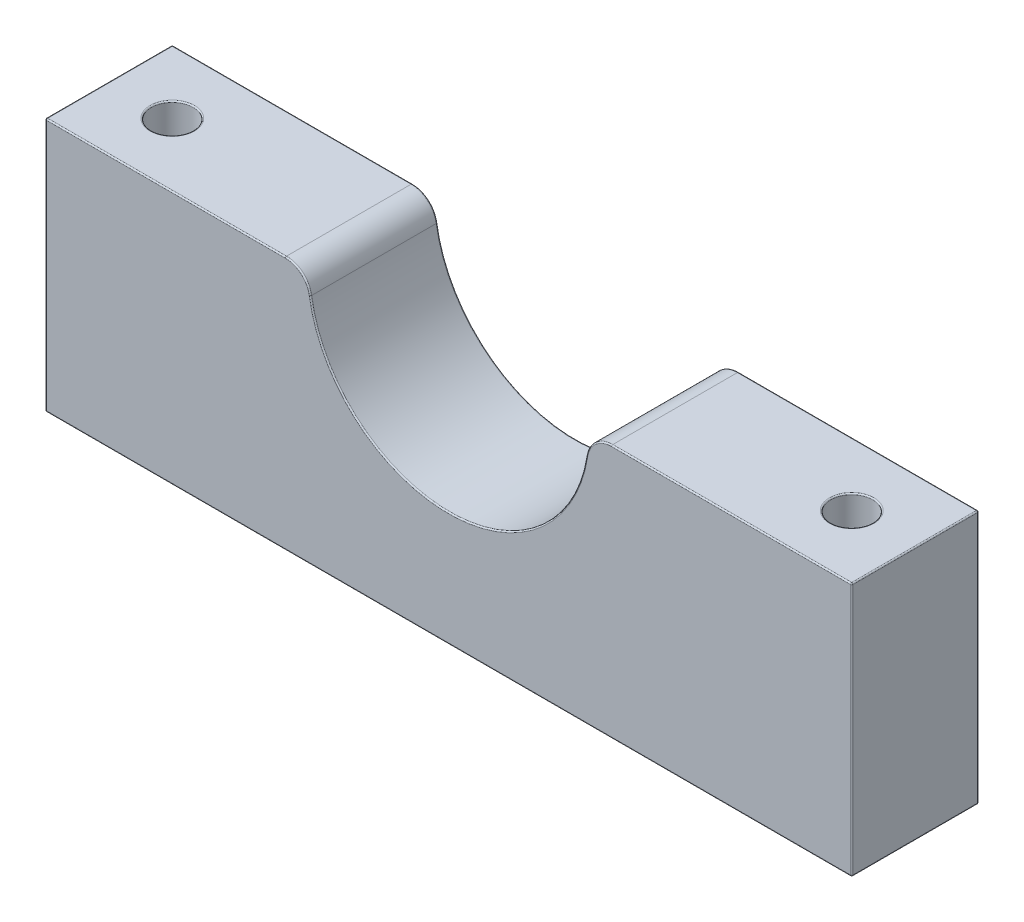
ISO-10303-21;
HEADER;
FILE_DESCRIPTION(('STEP AP214'),'2;1');
FILE_NAME('part.step','',(''),(''),'','','');
FILE_SCHEMA(('AUTOMOTIVE_DESIGN { 1 0 10303 214 1 1 1 1 }'));
ENDSEC;
DATA;
#1=APPLICATION_CONTEXT('core data for automotive mechanical design processes');
#2=APPLICATION_PROTOCOL_DEFINITION('international standard','automotive_design',2000,#1);
#3=PRODUCT_CONTEXT('',#1,'mechanical');
#4=PRODUCT('Part','Part','',(#3));
#5=PRODUCT_RELATED_PRODUCT_CATEGORY('part','',(#4));
#6=PRODUCT_DEFINITION_FORMATION('','',#4);
#7=PRODUCT_DEFINITION_CONTEXT('part definition',#1,'design');
#8=PRODUCT_DEFINITION('design','',#6,#7);
#9=PRODUCT_DEFINITION_SHAPE('','',#8);
#10=(LENGTH_UNIT() NAMED_UNIT(*) SI_UNIT(.MILLI.,.METRE.));
#11=(NAMED_UNIT(*) PLANE_ANGLE_UNIT() SI_UNIT($,.RADIAN.));
#12=(NAMED_UNIT(*) SI_UNIT($,.STERADIAN.) SOLID_ANGLE_UNIT());
#13=UNCERTAINTY_MEASURE_WITH_UNIT(LENGTH_MEASURE(1.E-05),#10,'distance_accuracy_value','');
#14=(GEOMETRIC_REPRESENTATION_CONTEXT(3) GLOBAL_UNCERTAINTY_ASSIGNED_CONTEXT((#13)) GLOBAL_UNIT_ASSIGNED_CONTEXT((#10,
#11,#12)) REPRESENTATION_CONTEXT('',''));
#15=CARTESIAN_POINT('',(0.,0.,0.));
#16=DIRECTION('',(0.,0.,1.));
#17=DIRECTION('',(1.,0.,0.));
#18=AXIS2_PLACEMENT_3D('',#15,#16,#17);
#19=CARTESIAN_POINT('',(0.,0.,10.));
#20=DIRECTION('',(0.,0.,-1.));
#21=DIRECTION('',(-1.,0.,0.));
#22=AXIS2_PLACEMENT_3D('',#19,#20,#21);
#23=CYLINDRICAL_SURFACE('',#22,11.);
#24=DIRECTION('',(0.,0.,-1.));
#25=VECTOR('',#24,1.);
#26=CARTESIAN_POINT('',(10.8690429511782,-1.69230769230769,10.));
#27=LINE('',#26,#25);
#28=CARTESIAN_POINT('',(10.8690429511782,-1.69230769230769,9.9));
#29=VERTEX_POINT('',#28);
#30=CARTESIAN_POINT('',(10.8690429511782,-1.69230769230769,0.0999999999999994));
#31=VERTEX_POINT('',#30);
#32=EDGE_CURVE('E196',#29,#31,#27,.T.);
#33=ORIENTED_EDGE('',*,*,#32,.T.);
#34=CARTESIAN_POINT('',(0.,0.,0.0999999999999994));
#35=DIRECTION('',(0.,0.,1.));
#36=DIRECTION('',(1.,0.,0.));
#37=AXIS2_PLACEMENT_3D('',#34,#35,#36);
#38=CIRCLE('',#37,11.);
#39=CARTESIAN_POINT('',(-10.8690429511782,-1.69230769230769,0.0999999999999994));
#40=VERTEX_POINT('',#39);
#41=EDGE_CURVE('E383',#31,#40,#38,.F.);
#42=ORIENTED_EDGE('',*,*,#41,.T.);
#43=DIRECTION('',(0.,0.,-1.));
#44=VECTOR('',#43,1.);
#45=CARTESIAN_POINT('',(-10.8690429511782,-1.69230769230769,10.));
#46=LINE('',#45,#44);
#47=CARTESIAN_POINT('',(-10.8690429511782,-1.69230769230769,9.9));
#48=VERTEX_POINT('',#47);
#49=EDGE_CURVE('E288',#40,#48,#46,.F.);
#50=ORIENTED_EDGE('',*,*,#49,.T.);
#51=CARTESIAN_POINT('',(0.,0.,9.9));
#52=DIRECTION('',(0.,0.,1.));
#53=DIRECTION('',(1.,0.,0.));
#54=AXIS2_PLACEMENT_3D('',#51,#52,#53);
#55=CIRCLE('',#54,11.);
#56=EDGE_CURVE('E207',#48,#29,#55,.T.);
#57=ORIENTED_EDGE('',*,*,#56,.T.);
#58=EDGE_LOOP('',(#33,#42,#50,#57));
#59=FACE_BOUND('',#58,.T.);
#60=ADVANCED_FACE('F37',(#59),#23,.F.);
#61=CARTESIAN_POINT('',(-31.75,0.,10.));
#62=DIRECTION('',(0.,-1.,0.));
#63=DIRECTION('',(1.,0.,0.));
#64=AXIS2_PLACEMENT_3D('',#61,#62,#63);
#65=PLANE('',#64);
#66=CARTESIAN_POINT('',(-26.75,0.,5.));
#67=DIRECTION('',(0.,-1.,0.));
#68=DIRECTION('',(1.,0.,0.));
#69=AXIS2_PLACEMENT_3D('',#66,#67,#68);
#70=CIRCLE('',#69,1.74999999999999);
#71=CARTESIAN_POINT('',(-25.,0.,5.));
#72=VERTEX_POINT('',#71);
#73=EDGE_CURVE('E337',#72,#72,#70,.T.);
#74=ORIENTED_EDGE('',*,*,#73,.T.);
#75=EDGE_LOOP('',(#74));
#76=FACE_BOUND('',#75,.T.);
#77=DIRECTION('',(0.,0.,-1.));
#78=VECTOR('',#77,1.);
#79=CARTESIAN_POINT('',(-12.8452325786651,0.,10.));
#80=LINE('',#79,#78);
#81=CARTESIAN_POINT('',(-12.8452325786651,0.,9.9));
#82=VERTEX_POINT('',#81);
#83=CARTESIAN_POINT('',(-12.8452325786651,0.,0.0999999999999994));
#84=VERTEX_POINT('',#83);
#85=EDGE_CURVE('E195',#82,#84,#80,.T.);
#86=ORIENTED_EDGE('',*,*,#85,.T.);
#87=DIRECTION('',(-1.,0.,0.));
#88=VECTOR('',#87,1.);
#89=CARTESIAN_POINT('',(-31.75,0.,0.0999999999999994));
#90=LINE('',#89,#88);
#91=CARTESIAN_POINT('',(-31.65,0.,0.0999999999999994));
#92=VERTEX_POINT('',#91);
#93=EDGE_CURVE('E335',#84,#92,#90,.T.);
#94=ORIENTED_EDGE('',*,*,#93,.T.);
#95=DIRECTION('',(0.,0.,-1.));
#96=VECTOR('',#95,1.);
#97=CARTESIAN_POINT('',(-31.65,0.,10.));
#98=LINE('',#97,#96);
#99=CARTESIAN_POINT('',(-31.65,0.,9.9));
#100=VERTEX_POINT('',#99);
#101=EDGE_CURVE('E333',#92,#100,#98,.F.);
#102=ORIENTED_EDGE('',*,*,#101,.T.);
#103=DIRECTION('',(-1.,0.,0.));
#104=VECTOR('',#103,1.);
#105=CARTESIAN_POINT('',(-12.8452325786651,0.,9.9));
#106=LINE('',#105,#104);
#107=EDGE_CURVE('E331',#100,#82,#106,.F.);
#108=ORIENTED_EDGE('',*,*,#107,.T.);
#109=EDGE_LOOP('',(#86,#94,#102,#108));
#110=FACE_BOUND('',#109,.T.);
#111=ADVANCED_FACE('F514',(#76,#110),#65,.F.);
#112=CARTESIAN_POINT('',(-31.75,0.,10.));
#113=DIRECTION('',(1.,0.,0.));
#114=DIRECTION('',(0.,1.,0.));
#115=AXIS2_PLACEMENT_3D('',#112,#113,#114);
#116=PLANE('',#115);
#117=DIRECTION('',(0.,0.,-1.));
#118=VECTOR('',#117,1.);
#119=CARTESIAN_POINT('',(-31.75,-0.0999999999999999,10.));
#120=LINE('',#119,#118);
#121=CARTESIAN_POINT('',(-31.75,-0.0999999999999999,9.9));
#122=VERTEX_POINT('',#121);
#123=CARTESIAN_POINT('',(-31.75,-0.0999999999999999,0.0999999999999994));
#124=VERTEX_POINT('',#123);
#125=EDGE_CURVE('E326',#122,#124,#120,.T.);
#126=ORIENTED_EDGE('',*,*,#125,.T.);
#127=DIRECTION('',(0.,-1.,0.));
#128=VECTOR('',#127,1.);
#129=CARTESIAN_POINT('',(-31.75,0.,0.0999999999999994));
#130=LINE('',#129,#128);
#131=CARTESIAN_POINT('',(-31.75,-19.9,0.0999999999999994));
#132=VERTEX_POINT('',#131);
#133=EDGE_CURVE('E329',#124,#132,#130,.T.);
#134=ORIENTED_EDGE('',*,*,#133,.T.);
#135=DIRECTION('',(0.,0.,-1.));
#136=VECTOR('',#135,1.);
#137=CARTESIAN_POINT('',(-31.75,-19.9,10.));
#138=LINE('',#137,#136);
#139=CARTESIAN_POINT('',(-31.75,-19.9,9.9));
#140=VERTEX_POINT('',#139);
#141=EDGE_CURVE('E324',#132,#140,#138,.F.);
#142=ORIENTED_EDGE('',*,*,#141,.T.);
#143=DIRECTION('',(0.,-1.,0.));
#144=VECTOR('',#143,1.);
#145=CARTESIAN_POINT('',(-31.75,0.,9.9));
#146=LINE('',#145,#144);
#147=EDGE_CURVE('E322',#140,#122,#146,.F.);
#148=ORIENTED_EDGE('',*,*,#147,.T.);
#149=EDGE_LOOP('',(#126,#134,#142,#148));
#150=FACE_BOUND('',#149,.T.);
#151=ADVANCED_FACE('F519',(#150),#116,.F.);
#152=CARTESIAN_POINT('',(-31.75,-20.,10.));
#153=DIRECTION('',(0.,1.,0.));
#154=DIRECTION('',(0.,0.,1.));
#155=AXIS2_PLACEMENT_3D('',#152,#153,#154);
#156=PLANE('',#155);
#157=CARTESIAN_POINT('',(26.75,-20.,5.));
#158=DIRECTION('',(0.,1.,0.));
#159=DIRECTION('',(0.,0.,1.));
#160=AXIS2_PLACEMENT_3D('',#157,#158,#159);
#161=CIRCLE('',#160,1.74999999999999);
#162=CARTESIAN_POINT('',(26.75,-20.,6.74999999999999));
#163=VERTEX_POINT('',#162);
#164=EDGE_CURVE('E358',#163,#163,#161,.T.);
#165=ORIENTED_EDGE('',*,*,#164,.T.);
#166=EDGE_LOOP('',(#165));
#167=FACE_BOUND('',#166,.T.);
#168=CARTESIAN_POINT('',(-26.75,-20.,5.));
#169=DIRECTION('',(0.,1.,0.));
#170=DIRECTION('',(0.,0.,1.));
#171=AXIS2_PLACEMENT_3D('',#168,#169,#170);
#172=CIRCLE('',#171,1.74999999999999);
#173=CARTESIAN_POINT('',(-26.75,-20.,6.74999999999999));
#174=VERTEX_POINT('',#173);
#175=EDGE_CURVE('E355',#174,#174,#172,.T.);
#176=ORIENTED_EDGE('',*,*,#175,.T.);
#177=EDGE_LOOP('',(#176));
#178=FACE_BOUND('',#177,.T.);
#179=DIRECTION('',(0.,0.,-1.));
#180=VECTOR('',#179,1.);
#181=CARTESIAN_POINT('',(-31.65,-20.,10.));
#182=LINE('',#181,#180);
#183=CARTESIAN_POINT('',(-31.65,-20.,9.9));
#184=VERTEX_POINT('',#183);
#185=CARTESIAN_POINT('',(-31.65,-20.,0.0999999999999994));
#186=VERTEX_POINT('',#185);
#187=EDGE_CURVE('E350',#184,#186,#182,.T.);
#188=ORIENTED_EDGE('',*,*,#187,.T.);
#189=DIRECTION('',(1.,0.,0.));
#190=VECTOR('',#189,1.);
#191=CARTESIAN_POINT('',(-31.75,-20.,0.0999999999999994));
#192=LINE('',#191,#190);
#193=CARTESIAN_POINT('',(31.65,-20.,0.0999999999999994));
#194=VERTEX_POINT('',#193);
#195=EDGE_CURVE('E353',#186,#194,#192,.T.);
#196=ORIENTED_EDGE('',*,*,#195,.T.);
#197=DIRECTION('',(0.,0.,-1.));
#198=VECTOR('',#197,1.);
#199=CARTESIAN_POINT('',(31.65,-20.,10.));
#200=LINE('',#199,#198);
#201=CARTESIAN_POINT('',(31.65,-20.,9.9));
#202=VERTEX_POINT('',#201);
#203=EDGE_CURVE('E348',#194,#202,#200,.F.);
#204=ORIENTED_EDGE('',*,*,#203,.T.);
#205=DIRECTION('',(1.,0.,0.));
#206=VECTOR('',#205,1.);
#207=CARTESIAN_POINT('',(-31.75,-20.,9.9));
#208=LINE('',#207,#206);
#209=EDGE_CURVE('E346',#202,#184,#208,.F.);
#210=ORIENTED_EDGE('',*,*,#209,.T.);
#211=EDGE_LOOP('',(#188,#196,#204,#210));
#212=FACE_BOUND('',#211,.T.);
#213=ADVANCED_FACE('F452',(#167,#178,#212),#156,.F.);
#214=CARTESIAN_POINT('',(31.75,0.,10.));
#215=DIRECTION('',(-1.,0.,0.));
#216=DIRECTION('',(0.,-1.,0.));
#217=AXIS2_PLACEMENT_3D('',#214,#215,#216);
#218=PLANE('',#217);
#219=DIRECTION('',(0.,0.,-1.));
#220=VECTOR('',#219,1.);
#221=CARTESIAN_POINT('',(31.75,-19.9,10.));
#222=LINE('',#221,#220);
#223=CARTESIAN_POINT('',(31.75,-19.9,9.9));
#224=VERTEX_POINT('',#223);
#225=CARTESIAN_POINT('',(31.75,-19.9,0.0999999999999994));
#226=VERTEX_POINT('',#225);
#227=EDGE_CURVE('E309',#224,#226,#222,.T.);
#228=ORIENTED_EDGE('',*,*,#227,.T.);
#229=DIRECTION('',(0.,1.,0.));
#230=VECTOR('',#229,1.);
#231=CARTESIAN_POINT('',(31.75,0.,0.0999999999999994));
#232=LINE('',#231,#230);
#233=CARTESIAN_POINT('',(31.75,-0.0999999999999922,0.0999999999999994));
#234=VERTEX_POINT('',#233);
#235=EDGE_CURVE('E314',#226,#234,#232,.T.);
#236=ORIENTED_EDGE('',*,*,#235,.T.);
#237=DIRECTION('',(0.,0.,-1.));
#238=VECTOR('',#237,1.);
#239=CARTESIAN_POINT('',(31.75,-0.0999999999999922,10.));
#240=LINE('',#239,#238);
#241=CARTESIAN_POINT('',(31.75,-0.0999999999999922,9.9));
#242=VERTEX_POINT('',#241);
#243=EDGE_CURVE('E311',#234,#242,#240,.F.);
#244=ORIENTED_EDGE('',*,*,#243,.T.);
#245=DIRECTION('',(0.,1.,0.));
#246=VECTOR('',#245,1.);
#247=CARTESIAN_POINT('',(31.75,-20.,9.9));
#248=LINE('',#247,#246);
#249=EDGE_CURVE('E307',#242,#224,#248,.F.);
#250=ORIENTED_EDGE('',*,*,#249,.T.);
#251=EDGE_LOOP('',(#228,#236,#244,#250));
#252=FACE_BOUND('',#251,.T.);
#253=ADVANCED_FACE('F423',(#252),#218,.F.);
#254=CARTESIAN_POINT('',(11.,0.,10.));
#255=DIRECTION('',(0.,-1.,0.));
#256=DIRECTION('',(1.,0.,0.));
#257=AXIS2_PLACEMENT_3D('',#254,#255,#256);
#258=PLANE('',#257);
#259=CARTESIAN_POINT('',(26.75,0.,5.));
#260=DIRECTION('',(0.,-1.,0.));
#261=DIRECTION('',(1.,0.,0.));
#262=AXIS2_PLACEMENT_3D('',#259,#260,#261);
#263=CIRCLE('',#262,1.74999999999999);
#264=CARTESIAN_POINT('',(28.5,0.,5.));
#265=VERTEX_POINT('',#264);
#266=EDGE_CURVE('E185',#265,#265,#263,.T.);
#267=ORIENTED_EDGE('',*,*,#266,.T.);
#268=EDGE_LOOP('',(#267));
#269=FACE_BOUND('',#268,.T.);
#270=DIRECTION('',(0.,0.,-1.));
#271=VECTOR('',#270,1.);
#272=CARTESIAN_POINT('',(31.65,0.,10.));
#273=LINE('',#272,#271);
#274=CARTESIAN_POINT('',(31.65,0.,9.9));
#275=VERTEX_POINT('',#274);
#276=CARTESIAN_POINT('',(31.65,0.,0.0999999999999994));
#277=VERTEX_POINT('',#276);
#278=EDGE_CURVE('E181',#275,#277,#273,.T.);
#279=ORIENTED_EDGE('',*,*,#278,.T.);
#280=DIRECTION('',(-1.,0.,0.));
#281=VECTOR('',#280,1.);
#282=CARTESIAN_POINT('',(11.,0.,0.0999999999999994));
#283=LINE('',#282,#281);
#284=CARTESIAN_POINT('',(12.8452325786651,0.,0.0999999999999994));
#285=VERTEX_POINT('',#284);
#286=EDGE_CURVE('E175',#277,#285,#283,.T.);
#287=ORIENTED_EDGE('',*,*,#286,.T.);
#288=DIRECTION('',(0.,0.,-1.));
#289=VECTOR('',#288,1.);
#290=CARTESIAN_POINT('',(12.8452325786651,0.,10.));
#291=LINE('',#290,#289);
#292=CARTESIAN_POINT('',(12.8452325786651,0.,9.9));
#293=VERTEX_POINT('',#292);
#294=EDGE_CURVE('E178',#285,#293,#291,.F.);
#295=ORIENTED_EDGE('',*,*,#294,.T.);
#296=DIRECTION('',(-1.,0.,0.));
#297=VECTOR('',#296,1.);
#298=CARTESIAN_POINT('',(31.75,0.,9.9));
#299=LINE('',#298,#297);
#300=EDGE_CURVE('E302',#293,#275,#299,.F.);
#301=ORIENTED_EDGE('',*,*,#300,.T.);
#302=EDGE_LOOP('',(#279,#287,#295,#301));
#303=FACE_BOUND('',#302,.T.);
#304=ADVANCED_FACE('F177',(#269,#303),#258,.F.);
#305=CARTESIAN_POINT('',(0.,0.,10.));
#306=DIRECTION('',(0.,0.,1.));
#307=DIRECTION('',(1.,0.,0.));
#308=AXIS2_PLACEMENT_3D('',#305,#306,#307);
#309=PLANE('',#308);
#310=DIRECTION('',(1.,0.,0.));
#311=VECTOR('',#310,1.);
#312=CARTESIAN_POINT('',(31.75,-19.9,10.));
#313=LINE('',#312,#311);
#314=CARTESIAN_POINT('',(-31.65,-19.9,10.));
#315=VERTEX_POINT('',#314);
#316=CARTESIAN_POINT('',(31.65,-19.9,10.));
#317=VERTEX_POINT('',#316);
#318=EDGE_CURVE('E46',#315,#317,#313,.T.);
#319=ORIENTED_EDGE('',*,*,#318,.T.);
#320=DIRECTION('',(0.,1.,0.));
#321=VECTOR('',#320,1.);
#322=CARTESIAN_POINT('',(31.65,0.,10.));
#323=LINE('',#322,#321);
#324=CARTESIAN_POINT('',(31.65,-0.0999999999999922,10.));
#325=VERTEX_POINT('',#324);
#326=EDGE_CURVE('E11',#317,#325,#323,.T.);
#327=ORIENTED_EDGE('',*,*,#326,.T.);
#328=DIRECTION('',(-1.,0.,0.));
#329=VECTOR('',#328,1.);
#330=CARTESIAN_POINT('',(12.8452325786651,-0.0999999999999945,10.));
#331=LINE('',#330,#329);
#332=CARTESIAN_POINT('',(12.8452325786651,-0.0999999999999945,10.));
#333=VERTEX_POINT('',#332);
#334=EDGE_CURVE('E385',#325,#333,#331,.T.);
#335=ORIENTED_EDGE('',*,*,#334,.T.);
#336=CARTESIAN_POINT('',(12.8452325786651,-1.99999999999999,10.));
#337=DIRECTION('',(0.,0.,1.));
#338=DIRECTION('',(1.,0.,0.));
#339=AXIS2_PLACEMENT_3D('',#336,#337,#338);
#340=CIRCLE('',#339,1.9);
#341=CARTESIAN_POINT('',(10.9678524325525,-1.7076923076923,10.));
#342=VERTEX_POINT('',#341);
#343=EDGE_CURVE('E387',#333,#342,#340,.T.);
#344=ORIENTED_EDGE('',*,*,#343,.T.);
#345=CARTESIAN_POINT('',(0.,0.,10.));
#346=DIRECTION('',(0.,0.,1.));
#347=DIRECTION('',(1.,0.,0.));
#348=AXIS2_PLACEMENT_3D('',#345,#346,#347);
#349=CIRCLE('',#348,11.1);
#350=CARTESIAN_POINT('',(-10.9678524325525,-1.70769230769231,10.));
#351=VERTEX_POINT('',#350);
#352=EDGE_CURVE('E389',#342,#351,#349,.F.);
#353=ORIENTED_EDGE('',*,*,#352,.T.);
#354=CARTESIAN_POINT('',(-12.8452325786651,-2.,10.));
#355=DIRECTION('',(0.,0.,1.));
#356=DIRECTION('',(1.,0.,0.));
#357=AXIS2_PLACEMENT_3D('',#354,#355,#356);
#358=CIRCLE('',#357,1.9);
#359=CARTESIAN_POINT('',(-12.8452325786651,-0.0999999999999979,10.));
#360=VERTEX_POINT('',#359);
#361=EDGE_CURVE('E391',#351,#360,#358,.T.);
#362=ORIENTED_EDGE('',*,*,#361,.T.);
#363=DIRECTION('',(-1.,0.,0.));
#364=VECTOR('',#363,1.);
#365=CARTESIAN_POINT('',(-31.75,-0.1,10.));
#366=LINE('',#365,#364);
#367=CARTESIAN_POINT('',(-31.65,-0.1,10.));
#368=VERTEX_POINT('',#367);
#369=EDGE_CURVE('E393',#360,#368,#366,.T.);
#370=ORIENTED_EDGE('',*,*,#369,.T.);
#371=DIRECTION('',(0.,-1.,0.));
#372=VECTOR('',#371,1.);
#373=CARTESIAN_POINT('',(-31.65,-20.,10.));
#374=LINE('',#373,#372);
#375=EDGE_CURVE('E57',#368,#315,#374,.T.);
#376=ORIENTED_EDGE('',*,*,#375,.T.);
#377=EDGE_LOOP('',(#319,#327,#335,#344,#353,#362,#370,#376));
#378=FACE_BOUND('',#377,.T.);
#379=ADVANCED_FACE('F501',(#378),#309,.T.);
#380=CARTESIAN_POINT('',(0.,0.,0.));
#381=DIRECTION('',(0.,0.,1.));
#382=DIRECTION('',(1.,0.,0.));
#383=AXIS2_PLACEMENT_3D('',#380,#381,#382);
#384=PLANE('',#383);
#385=DIRECTION('',(-1.,0.,0.));
#386=VECTOR('',#385,1.);
#387=CARTESIAN_POINT('',(0.,-0.0999999999999961,0.));
#388=LINE('',#387,#386);
#389=CARTESIAN_POINT('',(-31.65,-0.1,0.));
#390=VERTEX_POINT('',#389);
#391=CARTESIAN_POINT('',(-12.8452325786651,-0.0999999999999977,0.));
#392=VERTEX_POINT('',#391);
#393=EDGE_CURVE('E372',#390,#392,#388,.F.);
#394=ORIENTED_EDGE('',*,*,#393,.T.);
#395=CARTESIAN_POINT('',(-12.8452325786651,-2.,0.));
#396=DIRECTION('',(0.,0.,1.));
#397=DIRECTION('',(1.,0.,0.));
#398=AXIS2_PLACEMENT_3D('',#395,#396,#397);
#399=CIRCLE('',#398,1.9);
#400=CARTESIAN_POINT('',(-10.9678524325525,-1.70769230769231,0.));
#401=VERTEX_POINT('',#400);
#402=EDGE_CURVE('E374',#392,#401,#399,.F.);
#403=ORIENTED_EDGE('',*,*,#402,.T.);
#404=CARTESIAN_POINT('',(0.,0.,0.));
#405=DIRECTION('',(0.,0.,1.));
#406=DIRECTION('',(1.,0.,0.));
#407=AXIS2_PLACEMENT_3D('',#404,#405,#406);
#408=CIRCLE('',#407,11.1);
#409=CARTESIAN_POINT('',(10.9678524325525,-1.7076923076923,0.));
#410=VERTEX_POINT('',#409);
#411=EDGE_CURVE('E361',#401,#410,#408,.T.);
#412=ORIENTED_EDGE('',*,*,#411,.T.);
#413=CARTESIAN_POINT('',(12.8452325786651,-1.99999999999999,0.));
#414=DIRECTION('',(0.,0.,1.));
#415=DIRECTION('',(1.,0.,0.));
#416=AXIS2_PLACEMENT_3D('',#413,#414,#415);
#417=CIRCLE('',#416,1.9);
#418=CARTESIAN_POINT('',(12.8452325786651,-0.0999999999999945,0.));
#419=VERTEX_POINT('',#418);
#420=EDGE_CURVE('E363',#410,#419,#417,.F.);
#421=ORIENTED_EDGE('',*,*,#420,.T.);
#422=DIRECTION('',(-1.,0.,0.));
#423=VECTOR('',#422,1.);
#424=CARTESIAN_POINT('',(0.,-0.0999999999999961,0.));
#425=LINE('',#424,#423);
#426=CARTESIAN_POINT('',(31.65,-0.0999999999999922,0.));
#427=VERTEX_POINT('',#426);
#428=EDGE_CURVE('E210',#419,#427,#425,.F.);
#429=ORIENTED_EDGE('',*,*,#428,.T.);
#430=DIRECTION('',(0.,1.,0.));
#431=VECTOR('',#430,1.);
#432=CARTESIAN_POINT('',(31.65,0.,0.));
#433=LINE('',#432,#431);
#434=CARTESIAN_POINT('',(31.65,-19.9,0.));
#435=VERTEX_POINT('',#434);
#436=EDGE_CURVE('E366',#427,#435,#433,.F.);
#437=ORIENTED_EDGE('',*,*,#436,.T.);
#438=DIRECTION('',(1.,0.,0.));
#439=VECTOR('',#438,1.);
#440=CARTESIAN_POINT('',(0.,-19.9,0.));
#441=LINE('',#440,#439);
#442=CARTESIAN_POINT('',(-31.65,-19.9,0.));
#443=VERTEX_POINT('',#442);
#444=EDGE_CURVE('E368',#435,#443,#441,.F.);
#445=ORIENTED_EDGE('',*,*,#444,.T.);
#446=DIRECTION('',(0.,-1.,0.));
#447=VECTOR('',#446,1.);
#448=CARTESIAN_POINT('',(-31.65,0.,0.));
#449=LINE('',#448,#447);
#450=EDGE_CURVE('E370',#443,#390,#449,.F.);
#451=ORIENTED_EDGE('',*,*,#450,.T.);
#452=EDGE_LOOP('',(#394,#403,#412,#421,#429,#437,#445,#451));
#453=FACE_BOUND('',#452,.T.);
#454=ADVANCED_FACE('F437',(#453),#384,.F.);
#455=CARTESIAN_POINT('',(26.75,-20.,5.));
#456=DIRECTION('',(0.,-1.,0.));
#457=DIRECTION('',(0.,0.,-1.));
#458=AXIS2_PLACEMENT_3D('',#455,#456,#457);
#459=CYLINDRICAL_SURFACE('',#458,1.64999999999999);
#460=CARTESIAN_POINT('',(26.75,-0.0999999999999925,5.));
#461=DIRECTION('',(0.,-1.,0.));
#462=DIRECTION('',(1.,0.,0.));
#463=AXIS2_PLACEMENT_3D('',#460,#461,#462);
#464=CIRCLE('',#463,1.64999999999999);
#465=CARTESIAN_POINT('',(28.4,-0.0999999999999922,5.));
#466=VERTEX_POINT('',#465);
#467=EDGE_CURVE('E319',#466,#466,#464,.F.);
#468=ORIENTED_EDGE('',*,*,#467,.T.);
#469=EDGE_LOOP('',(#468));
#470=FACE_BOUND('',#469,.T.);
#471=CARTESIAN_POINT('',(26.75,-19.9,5.));
#472=DIRECTION('',(0.,1.,0.));
#473=DIRECTION('',(0.,0.,1.));
#474=AXIS2_PLACEMENT_3D('',#471,#472,#473);
#475=CIRCLE('',#474,1.64999999999999);
#476=CARTESIAN_POINT('',(26.75,-19.9,6.64999999999999));
#477=VERTEX_POINT('',#476);
#478=EDGE_CURVE('E316',#477,#477,#475,.F.);
#479=ORIENTED_EDGE('',*,*,#478,.T.);
#480=EDGE_LOOP('',(#479));
#481=FACE_BOUND('',#480,.T.);
#482=ADVANCED_FACE('F508',(#470,#481),#459,.F.);
#483=CARTESIAN_POINT('',(-26.75,-20.,5.));
#484=DIRECTION('',(0.,-1.,0.));
#485=DIRECTION('',(0.,0.,-1.));
#486=AXIS2_PLACEMENT_3D('',#483,#484,#485);
#487=CYLINDRICAL_SURFACE('',#486,1.64999999999999);
#488=CARTESIAN_POINT('',(-26.75,-0.0999999999999994,5.));
#489=DIRECTION('',(0.,-1.,0.));
#490=DIRECTION('',(1.,0.,0.));
#491=AXIS2_PLACEMENT_3D('',#488,#489,#490);
#492=CIRCLE('',#491,1.64999999999999);
#493=CARTESIAN_POINT('',(-25.1,-0.0999999999999992,5.));
#494=VERTEX_POINT('',#493);
#495=EDGE_CURVE('E343',#494,#494,#492,.F.);
#496=ORIENTED_EDGE('',*,*,#495,.T.);
#497=EDGE_LOOP('',(#496));
#498=FACE_BOUND('',#497,.T.);
#499=CARTESIAN_POINT('',(-26.75,-19.9,5.));
#500=DIRECTION('',(0.,1.,0.));
#501=DIRECTION('',(0.,0.,1.));
#502=AXIS2_PLACEMENT_3D('',#499,#500,#501);
#503=CIRCLE('',#502,1.64999999999999);
#504=CARTESIAN_POINT('',(-26.75,-19.9,6.64999999999999));
#505=VERTEX_POINT('',#504);
#506=EDGE_CURVE('E340',#505,#505,#503,.F.);
#507=ORIENTED_EDGE('',*,*,#506,.T.);
#508=EDGE_LOOP('',(#507));
#509=FACE_BOUND('',#508,.T.);
#510=ADVANCED_FACE('F526',(#498,#509),#487,.F.);
#511=CARTESIAN_POINT('',(12.8452325786651,-1.99999999999999,10.));
#512=DIRECTION('',(0.,0.,-1.));
#513=DIRECTION('',(-1.,0.,0.));
#514=AXIS2_PLACEMENT_3D('',#511,#512,#513);
#515=CYLINDRICAL_SURFACE('',#514,2.);
#516=ORIENTED_EDGE('',*,*,#294,.F.);
#517=CARTESIAN_POINT('',(12.8452325786651,-1.99999999999999,0.0999999999999994));
#518=DIRECTION('',(0.,0.,1.));
#519=DIRECTION('',(1.,0.,0.));
#520=AXIS2_PLACEMENT_3D('',#517,#518,#519);
#521=CIRCLE('',#520,2.);
#522=EDGE_CURVE('E191',#285,#31,#521,.T.);
#523=ORIENTED_EDGE('',*,*,#522,.T.);
#524=ORIENTED_EDGE('',*,*,#32,.F.);
#525=CARTESIAN_POINT('',(12.8452325786651,-1.99999999999999,9.9));
#526=DIRECTION('',(0.,0.,1.));
#527=DIRECTION('',(1.,0.,0.));
#528=AXIS2_PLACEMENT_3D('',#525,#526,#527);
#529=CIRCLE('',#528,2.);
#530=EDGE_CURVE('E194',#29,#293,#529,.F.);
#531=ORIENTED_EDGE('',*,*,#530,.T.);
#532=EDGE_LOOP('',(#516,#523,#524,#531));
#533=FACE_BOUND('',#532,.T.);
#534=ADVANCED_FACE('F189',(#533),#515,.T.);
#535=CARTESIAN_POINT('',(-12.8452325786651,-2.,10.));
#536=DIRECTION('',(0.,0.,-1.));
#537=DIRECTION('',(-1.,0.,0.));
#538=AXIS2_PLACEMENT_3D('',#535,#536,#537);
#539=CYLINDRICAL_SURFACE('',#538,2.);
#540=ORIENTED_EDGE('',*,*,#49,.F.);
#541=CARTESIAN_POINT('',(-12.8452325786651,-2.,0.0999999999999994));
#542=DIRECTION('',(0.,0.,1.));
#543=DIRECTION('',(1.,0.,0.));
#544=AXIS2_PLACEMENT_3D('',#541,#542,#543);
#545=CIRCLE('',#544,2.);
#546=EDGE_CURVE('E379',#40,#84,#545,.T.);
#547=ORIENTED_EDGE('',*,*,#546,.T.);
#548=ORIENTED_EDGE('',*,*,#85,.F.);
#549=CARTESIAN_POINT('',(-12.8452325786651,-2.,9.9));
#550=DIRECTION('',(0.,0.,1.));
#551=DIRECTION('',(1.,0.,0.));
#552=AXIS2_PLACEMENT_3D('',#549,#550,#551);
#553=CIRCLE('',#552,2.);
#554=EDGE_CURVE('E377',#82,#48,#553,.F.);
#555=ORIENTED_EDGE('',*,*,#554,.T.);
#556=EDGE_LOOP('',(#540,#547,#548,#555));
#557=FACE_BOUND('',#556,.T.);
#558=ADVANCED_FACE('F483',(#557),#539,.T.);
#559=CARTESIAN_POINT('',(-31.65,-0.1,10.));
#560=DIRECTION('',(0.,0.,-1.));
#561=DIRECTION('',(-1.,0.,0.));
#562=AXIS2_PLACEMENT_3D('',#559,#560,#561);
#563=CYLINDRICAL_SURFACE('',#562,0.1);
#564=CARTESIAN_POINT('',(-31.65,-0.1,9.9));
#565=DIRECTION('',(0.,0.,1.));
#566=DIRECTION('',(1.,0.,0.));
#567=AXIS2_PLACEMENT_3D('',#564,#565,#566);
#568=CIRCLE('',#567,0.1);
#569=EDGE_CURVE('E41',#100,#122,#568,.T.);
#570=ORIENTED_EDGE('',*,*,#569,.F.);
#571=ORIENTED_EDGE('',*,*,#101,.F.);
#572=CARTESIAN_POINT('',(-31.65,-0.1,0.0999999999999994));
#573=DIRECTION('',(0.,0.,-1.));
#574=DIRECTION('',(-1.,0.,0.));
#575=AXIS2_PLACEMENT_3D('',#572,#573,#574);
#576=CIRCLE('',#575,0.1);
#577=EDGE_CURVE('E281',#124,#92,#576,.T.);
#578=ORIENTED_EDGE('',*,*,#577,.F.);
#579=ORIENTED_EDGE('',*,*,#125,.F.);
#580=EDGE_LOOP('',(#570,#571,#578,#579));
#581=FACE_BOUND('',#580,.T.);
#582=ADVANCED_FACE('F529',(#581),#563,.T.);
#583=CARTESIAN_POINT('',(-31.65,-0.1,9.9));
#584=DIRECTION('',(0.,0.,1.));
#585=DIRECTION('',(1.,0.,0.));
#586=AXIS2_PLACEMENT_3D('',#583,#584,#585);
#587=SPHERICAL_SURFACE('',#586,0.1);
#588=CARTESIAN_POINT('',(-31.65,-0.1,9.9));
#589=DIRECTION('',(-1.,0.,0.));
#590=DIRECTION('',(0.,0.,1.));
#591=AXIS2_PLACEMENT_3D('',#588,#589,#590);
#592=CIRCLE('',#591,0.1);
#593=EDGE_CURVE('E276',#100,#368,#592,.F.);
#594=ORIENTED_EDGE('',*,*,#593,.F.);
#595=ORIENTED_EDGE('',*,*,#569,.T.);
#596=CARTESIAN_POINT('',(-31.65,-0.1,9.9));
#597=DIRECTION('',(0.,1.,0.));
#598=DIRECTION('',(-1.,0.,0.));
#599=AXIS2_PLACEMENT_3D('',#596,#597,#598);
#600=CIRCLE('',#599,0.1);
#601=EDGE_CURVE('E279',#368,#122,#600,.F.);
#602=ORIENTED_EDGE('',*,*,#601,.F.);
#603=EDGE_LOOP('',(#594,#595,#602));
#604=FACE_BOUND('',#603,.T.);
#605=ADVANCED_FACE('F590',(#604),#587,.T.);
#606=CARTESIAN_POINT('',(-31.65,-0.1,0.1));
#607=DIRECTION('',(0.,0.,1.));
#608=DIRECTION('',(1.,0.,0.));
#609=AXIS2_PLACEMENT_3D('',#606,#607,#608);
#610=SPHERICAL_SURFACE('',#609,0.1);
#611=CARTESIAN_POINT('',(-31.65,-0.1,0.1));
#612=DIRECTION('',(0.,1.,0.));
#613=DIRECTION('',(-1.,0.,0.));
#614=AXIS2_PLACEMENT_3D('',#611,#612,#613);
#615=CIRCLE('',#614,0.1);
#616=EDGE_CURVE('E270',#124,#390,#615,.F.);
#617=ORIENTED_EDGE('',*,*,#616,.F.);
#618=ORIENTED_EDGE('',*,*,#577,.T.);
#619=CARTESIAN_POINT('',(-31.65,-0.1,0.0999999999999994));
#620=DIRECTION('',(-1.,0.,0.));
#621=DIRECTION('',(0.,0.,1.));
#622=AXIS2_PLACEMENT_3D('',#619,#620,#621);
#623=CIRCLE('',#622,0.1);
#624=EDGE_CURVE('E273',#390,#92,#623,.F.);
#625=ORIENTED_EDGE('',*,*,#624,.F.);
#626=EDGE_LOOP('',(#617,#618,#625));
#627=FACE_BOUND('',#626,.T.);
#628=ADVANCED_FACE('F586',(#627),#610,.T.);
#629=CARTESIAN_POINT('',(-31.65,0.,9.9));
#630=DIRECTION('',(0.,1.,0.));
#631=DIRECTION('',(-1.,0.,0.));
#632=AXIS2_PLACEMENT_3D('',#629,#630,#631);
#633=CYLINDRICAL_SURFACE('',#632,0.1);
#634=ORIENTED_EDGE('',*,*,#601,.T.);
#635=ORIENTED_EDGE('',*,*,#147,.F.);
#636=CARTESIAN_POINT('',(-31.65,-19.9,9.9));
#637=DIRECTION('',(0.,-1.,0.));
#638=DIRECTION('',(0.,0.,-1.));
#639=AXIS2_PLACEMENT_3D('',#636,#637,#638);
#640=CIRCLE('',#639,0.1);
#641=EDGE_CURVE('E264',#315,#140,#640,.T.);
#642=ORIENTED_EDGE('',*,*,#641,.F.);
#643=ORIENTED_EDGE('',*,*,#375,.F.);
#644=EDGE_LOOP('',(#634,#635,#642,#643));
#645=FACE_BOUND('',#644,.T.);
#646=ADVANCED_FACE('F582',(#645),#633,.T.);
#647=CARTESIAN_POINT('',(0.,-0.0999999999999961,9.9));
#648=DIRECTION('',(1.,0.,0.));
#649=DIRECTION('',(0.,1.,0.));
#650=AXIS2_PLACEMENT_3D('',#647,#648,#649);
#651=CYLINDRICAL_SURFACE('',#650,0.1);
#652=ORIENTED_EDGE('',*,*,#593,.T.);
#653=ORIENTED_EDGE('',*,*,#369,.F.);
#654=CARTESIAN_POINT('',(-12.8452325786651,-0.0999999999999977,9.9));
#655=DIRECTION('',(1.,0.,0.));
#656=DIRECTION('',(0.,0.,-1.));
#657=AXIS2_PLACEMENT_3D('',#654,#655,#656);
#658=CIRCLE('',#657,0.1);
#659=EDGE_CURVE('E261',#82,#360,#658,.T.);
#660=ORIENTED_EDGE('',*,*,#659,.F.);
#661=ORIENTED_EDGE('',*,*,#107,.F.);
#662=EDGE_LOOP('',(#652,#653,#660,#661));
#663=FACE_BOUND('',#662,.T.);
#664=ADVANCED_FACE('F579',(#663),#651,.T.);
#665=CARTESIAN_POINT('',(-31.75,-0.1,0.0999999999999994));
#666=DIRECTION('',(-1.,0.,0.));
#667=DIRECTION('',(0.,-1.,0.));
#668=AXIS2_PLACEMENT_3D('',#665,#666,#667);
#669=CYLINDRICAL_SURFACE('',#668,0.1);
#670=ORIENTED_EDGE('',*,*,#624,.T.);
#671=ORIENTED_EDGE('',*,*,#93,.F.);
#672=CARTESIAN_POINT('',(-12.8452325786651,-0.0999999999999977,0.1));
#673=DIRECTION('',(1.,0.,0.));
#674=DIRECTION('',(0.,0.,-1.));
#675=AXIS2_PLACEMENT_3D('',#672,#673,#674);
#676=CIRCLE('',#675,0.1);
#677=EDGE_CURVE('E258',#392,#84,#676,.T.);
#678=ORIENTED_EDGE('',*,*,#677,.F.);
#679=ORIENTED_EDGE('',*,*,#393,.F.);
#680=EDGE_LOOP('',(#670,#671,#678,#679));
#681=FACE_BOUND('',#680,.T.);
#682=ADVANCED_FACE('F474',(#681),#669,.T.);
#683=CARTESIAN_POINT('',(-31.65,0.,0.0999999999999994));
#684=DIRECTION('',(0.,-1.,0.));
#685=DIRECTION('',(1.,0.,0.));
#686=AXIS2_PLACEMENT_3D('',#683,#684,#685);
#687=CYLINDRICAL_SURFACE('',#686,0.1);
#688=ORIENTED_EDGE('',*,*,#616,.T.);
#689=ORIENTED_EDGE('',*,*,#450,.F.);
#690=CARTESIAN_POINT('',(-31.65,-19.9,0.0999999999999994));
#691=DIRECTION('',(0.,-1.,0.));
#692=DIRECTION('',(0.,0.,-1.));
#693=AXIS2_PLACEMENT_3D('',#690,#691,#692);
#694=CIRCLE('',#693,0.1);
#695=EDGE_CURVE('E255',#132,#443,#694,.T.);
#696=ORIENTED_EDGE('',*,*,#695,.F.);
#697=ORIENTED_EDGE('',*,*,#133,.F.);
#698=EDGE_LOOP('',(#688,#689,#696,#697));
#699=FACE_BOUND('',#698,.T.);
#700=ADVANCED_FACE('F468',(#699),#687,.T.);
#701=CARTESIAN_POINT('',(-31.65,-19.9,10.));
#702=DIRECTION('',(0.,0.,-1.));
#703=DIRECTION('',(-1.,0.,0.));
#704=AXIS2_PLACEMENT_3D('',#701,#702,#703);
#705=CYLINDRICAL_SURFACE('',#704,0.1);
#706=CARTESIAN_POINT('',(-31.65,-19.9,9.9));
#707=DIRECTION('',(0.,0.,1.));
#708=DIRECTION('',(1.,0.,0.));
#709=AXIS2_PLACEMENT_3D('',#706,#707,#708);
#710=CIRCLE('',#709,0.1);
#711=EDGE_CURVE('E267',#140,#184,#710,.T.);
#712=ORIENTED_EDGE('',*,*,#711,.F.);
#713=ORIENTED_EDGE('',*,*,#141,.F.);
#714=CARTESIAN_POINT('',(-31.65,-19.9,0.0999999999999994));
#715=DIRECTION('',(0.,0.,-1.));
#716=DIRECTION('',(-1.,0.,0.));
#717=AXIS2_PLACEMENT_3D('',#714,#715,#716);
#718=CIRCLE('',#717,0.1);
#719=EDGE_CURVE('E252',#186,#132,#718,.T.);
#720=ORIENTED_EDGE('',*,*,#719,.F.);
#721=ORIENTED_EDGE('',*,*,#187,.F.);
#722=EDGE_LOOP('',(#712,#713,#720,#721));
#723=FACE_BOUND('',#722,.T.);
#724=ADVANCED_FACE('F462',(#723),#705,.T.);
#725=CARTESIAN_POINT('',(-31.65,-19.9,9.9));
#726=DIRECTION('',(0.,0.,1.));
#727=DIRECTION('',(1.,0.,0.));
#728=AXIS2_PLACEMENT_3D('',#725,#726,#727);
#729=SPHERICAL_SURFACE('',#728,0.1);
#730=ORIENTED_EDGE('',*,*,#641,.T.);
#731=ORIENTED_EDGE('',*,*,#711,.T.);
#732=CARTESIAN_POINT('',(-31.65,-19.9,9.9));
#733=DIRECTION('',(-1.,0.,0.));
#734=DIRECTION('',(0.,0.,1.));
#735=AXIS2_PLACEMENT_3D('',#732,#733,#734);
#736=CIRCLE('',#735,0.1);
#737=EDGE_CURVE('E249',#315,#184,#736,.F.);
#738=ORIENTED_EDGE('',*,*,#737,.F.);
#739=EDGE_LOOP('',(#730,#731,#738));
#740=FACE_BOUND('',#739,.T.);
#741=ADVANCED_FACE('F458',(#740),#729,.T.);
#742=CARTESIAN_POINT('',(-12.8452325786651,-2.,9.9));
#743=DIRECTION('',(0.,0.,1.));
#744=DIRECTION('',(1.,0.,0.));
#745=AXIS2_PLACEMENT_3D('',#742,#743,#744);
#746=TOROIDAL_SURFACE('',#745,1.9,0.1);
#747=ORIENTED_EDGE('',*,*,#659,.T.);
#748=ORIENTED_EDGE('',*,*,#361,.F.);
#749=CARTESIAN_POINT('',(-10.9678524325525,-1.70769230769231,9.9));
#750=DIRECTION('',(0.153846153846155,-0.988094813743471,0.));
#751=DIRECTION('',(0.988094813743471,0.153846153846155,0.));
#752=AXIS2_PLACEMENT_3D('',#749,#750,#751);
#753=CIRCLE('',#752,0.1);
#754=EDGE_CURVE('E246',#48,#351,#753,.T.);
#755=ORIENTED_EDGE('',*,*,#754,.F.);
#756=ORIENTED_EDGE('',*,*,#554,.F.);
#757=EDGE_LOOP('',(#747,#748,#755,#756));
#758=FACE_BOUND('',#757,.T.);
#759=ADVANCED_FACE('F488',(#758),#746,.T.);
#760=CARTESIAN_POINT('',(-12.8452325786651,-2.,0.0999999999999994));
#761=DIRECTION('',(0.,0.,1.));
#762=DIRECTION('',(1.,0.,0.));
#763=AXIS2_PLACEMENT_3D('',#760,#761,#762);
#764=TOROIDAL_SURFACE('',#763,1.9,0.1);
#765=ORIENTED_EDGE('',*,*,#677,.T.);
#766=ORIENTED_EDGE('',*,*,#546,.F.);
#767=CARTESIAN_POINT('',(-10.9678524325525,-1.70769230769231,0.1));
#768=DIRECTION('',(0.153846153846157,-0.988094813743471,0.));
#769=DIRECTION('',(0.988094813743471,0.153846153846157,0.));
#770=AXIS2_PLACEMENT_3D('',#767,#768,#769);
#771=CIRCLE('',#770,0.1);
#772=EDGE_CURVE('E243',#401,#40,#771,.T.);
#773=ORIENTED_EDGE('',*,*,#772,.F.);
#774=ORIENTED_EDGE('',*,*,#402,.F.);
#775=EDGE_LOOP('',(#765,#766,#773,#774));
#776=FACE_BOUND('',#775,.T.);
#777=ADVANCED_FACE('F478',(#776),#764,.T.);
#778=CARTESIAN_POINT('',(-31.65,-19.9,0.1));
#779=DIRECTION('',(0.,0.,1.));
#780=DIRECTION('',(1.,0.,0.));
#781=AXIS2_PLACEMENT_3D('',#778,#779,#780);
#782=SPHERICAL_SURFACE('',#781,0.1);
#783=ORIENTED_EDGE('',*,*,#719,.T.);
#784=ORIENTED_EDGE('',*,*,#695,.T.);
#785=CARTESIAN_POINT('',(-31.65,-19.9,0.1));
#786=DIRECTION('',(-1.,0.,0.));
#787=DIRECTION('',(0.,0.,1.));
#788=AXIS2_PLACEMENT_3D('',#785,#786,#787);
#789=CIRCLE('',#788,0.1);
#790=EDGE_CURVE('E240',#186,#443,#789,.F.);
#791=ORIENTED_EDGE('',*,*,#790,.F.);
#792=EDGE_LOOP('',(#783,#784,#791));
#793=FACE_BOUND('',#792,.T.);
#794=ADVANCED_FACE('F466',(#793),#782,.T.);
#795=CARTESIAN_POINT('',(0.,-19.9,9.9));
#796=DIRECTION('',(-1.,0.,0.));
#797=DIRECTION('',(0.,0.,1.));
#798=AXIS2_PLACEMENT_3D('',#795,#796,#797);
#799=CYLINDRICAL_SURFACE('',#798,0.1);
#800=ORIENTED_EDGE('',*,*,#737,.T.);
#801=ORIENTED_EDGE('',*,*,#209,.F.);
#802=CARTESIAN_POINT('',(31.65,-19.9,9.9));
#803=DIRECTION('',(1.,0.,0.));
#804=DIRECTION('',(0.,0.,-1.));
#805=AXIS2_PLACEMENT_3D('',#802,#803,#804);
#806=CIRCLE('',#805,0.1);
#807=EDGE_CURVE('E234',#317,#202,#806,.T.);
#808=ORIENTED_EDGE('',*,*,#807,.F.);
#809=ORIENTED_EDGE('',*,*,#318,.F.);
#810=EDGE_LOOP('',(#800,#801,#808,#809));
#811=FACE_BOUND('',#810,.T.);
#812=ADVANCED_FACE('F455',(#811),#799,.T.);
#813=CARTESIAN_POINT('',(0.,0.,9.9));
#814=DIRECTION('',(0.,0.,1.));
#815=DIRECTION('',(1.,0.,0.));
#816=AXIS2_PLACEMENT_3D('',#813,#814,#815);
#817=TOROIDAL_SURFACE('',#816,11.1,0.1);
#818=ORIENTED_EDGE('',*,*,#754,.T.);
#819=ORIENTED_EDGE('',*,*,#352,.F.);
#820=CARTESIAN_POINT('',(10.9678524325525,-1.7076923076923,9.9));
#821=DIRECTION('',(0.153846153846155,0.988094813743471,0.));
#822=DIRECTION('',(-0.988094813743471,0.153846153846155,0.));
#823=AXIS2_PLACEMENT_3D('',#820,#821,#822);
#824=CIRCLE('',#823,0.1);
#825=EDGE_CURVE('E231',#29,#342,#824,.T.);
#826=ORIENTED_EDGE('',*,*,#825,.F.);
#827=ORIENTED_EDGE('',*,*,#56,.F.);
#828=EDGE_LOOP('',(#818,#819,#826,#827));
#829=FACE_BOUND('',#828,.T.);
#830=ADVANCED_FACE('F494',(#829),#817,.T.);
#831=CARTESIAN_POINT('',(0.,0.,0.0999999999999994));
#832=DIRECTION('',(0.,0.,1.));
#833=DIRECTION('',(1.,0.,0.));
#834=AXIS2_PLACEMENT_3D('',#831,#832,#833);
#835=TOROIDAL_SURFACE('',#834,11.1,0.1);
#836=ORIENTED_EDGE('',*,*,#772,.T.);
#837=ORIENTED_EDGE('',*,*,#41,.F.);
#838=CARTESIAN_POINT('',(10.9678524325525,-1.7076923076923,0.1));
#839=DIRECTION('',(0.153846153846153,0.988094813743472,0.));
#840=DIRECTION('',(-0.988094813743472,0.153846153846153,0.));
#841=AXIS2_PLACEMENT_3D('',#838,#839,#840);
#842=CIRCLE('',#841,0.1);
#843=EDGE_CURVE('E206',#410,#31,#842,.T.);
#844=ORIENTED_EDGE('',*,*,#843,.F.);
#845=ORIENTED_EDGE('',*,*,#411,.F.);
#846=EDGE_LOOP('',(#836,#837,#844,#845));
#847=FACE_BOUND('',#846,.T.);
#848=ADVANCED_FACE('F481',(#847),#835,.T.);
#849=CARTESIAN_POINT('',(-31.75,-19.9,0.0999999999999994));
#850=DIRECTION('',(1.,0.,0.));
#851=DIRECTION('',(0.,0.,-1.));
#852=AXIS2_PLACEMENT_3D('',#849,#850,#851);
#853=CYLINDRICAL_SURFACE('',#852,0.1);
#854=ORIENTED_EDGE('',*,*,#790,.T.);
#855=ORIENTED_EDGE('',*,*,#444,.F.);
#856=CARTESIAN_POINT('',(31.65,-19.9,0.0999999999999994));
#857=DIRECTION('',(1.,0.,0.));
#858=DIRECTION('',(0.,0.,-1.));
#859=AXIS2_PLACEMENT_3D('',#856,#857,#858);
#860=CIRCLE('',#859,0.1);
#861=EDGE_CURVE('E227',#194,#435,#860,.T.);
#862=ORIENTED_EDGE('',*,*,#861,.F.);
#863=ORIENTED_EDGE('',*,*,#195,.F.);
#864=EDGE_LOOP('',(#854,#855,#862,#863));
#865=FACE_BOUND('',#864,.T.);
#866=ADVANCED_FACE('F441',(#865),#853,.T.);
#867=CARTESIAN_POINT('',(31.65,-19.9,10.));
#868=DIRECTION('',(0.,0.,-1.));
#869=DIRECTION('',(-1.,0.,0.));
#870=AXIS2_PLACEMENT_3D('',#867,#868,#869);
#871=CYLINDRICAL_SURFACE('',#870,0.1);
#872=CARTESIAN_POINT('',(31.65,-19.9,9.9));
#873=DIRECTION('',(0.,0.,1.));
#874=DIRECTION('',(1.,0.,0.));
#875=AXIS2_PLACEMENT_3D('',#872,#873,#874);
#876=CIRCLE('',#875,0.1);
#877=EDGE_CURVE('E237',#202,#224,#876,.T.);
#878=ORIENTED_EDGE('',*,*,#877,.F.);
#879=ORIENTED_EDGE('',*,*,#203,.F.);
#880=CARTESIAN_POINT('',(31.65,-19.9,0.0999999999999994));
#881=DIRECTION('',(0.,0.,-1.));
#882=DIRECTION('',(-1.,0.,0.));
#883=AXIS2_PLACEMENT_3D('',#880,#881,#882);
#884=CIRCLE('',#883,0.1);
#885=EDGE_CURVE('E224',#226,#194,#884,.T.);
#886=ORIENTED_EDGE('',*,*,#885,.F.);
#887=ORIENTED_EDGE('',*,*,#227,.F.);
#888=EDGE_LOOP('',(#878,#879,#886,#887));
#889=FACE_BOUND('',#888,.T.);
#890=ADVANCED_FACE('F449',(#889),#871,.T.);
#891=CARTESIAN_POINT('',(31.65,-19.9,9.9));
#892=DIRECTION('',(0.,0.,1.));
#893=DIRECTION('',(1.,0.,0.));
#894=AXIS2_PLACEMENT_3D('',#891,#892,#893);
#895=SPHERICAL_SURFACE('',#894,0.1);
#896=ORIENTED_EDGE('',*,*,#807,.T.);
#897=ORIENTED_EDGE('',*,*,#877,.T.);
#898=CARTESIAN_POINT('',(31.65,-19.9,9.9));
#899=DIRECTION('',(0.,-1.,0.));
#900=DIRECTION('',(0.,0.,-1.));
#901=AXIS2_PLACEMENT_3D('',#898,#899,#900);
#902=CIRCLE('',#901,0.1);
#903=EDGE_CURVE('E215',#317,#224,#902,.F.);
#904=ORIENTED_EDGE('',*,*,#903,.F.);
#905=EDGE_LOOP('',(#896,#897,#904));
#906=FACE_BOUND('',#905,.T.);
#907=ADVANCED_FACE('F551',(#906),#895,.T.);
#908=CARTESIAN_POINT('',(12.8452325786651,-1.99999999999999,9.9));
#909=DIRECTION('',(0.,0.,1.));
#910=DIRECTION('',(1.,0.,0.));
#911=AXIS2_PLACEMENT_3D('',#908,#909,#910);
#912=TOROIDAL_SURFACE('',#911,1.9,0.1);
#913=ORIENTED_EDGE('',*,*,#825,.T.);
#914=ORIENTED_EDGE('',*,*,#343,.F.);
#915=CARTESIAN_POINT('',(12.8452325786651,-0.0999999999999945,9.9));
#916=DIRECTION('',(1.,0.,0.));
#917=DIRECTION('',(0.,0.,-1.));
#918=AXIS2_PLACEMENT_3D('',#915,#916,#917);
#919=CIRCLE('',#918,0.1);
#920=EDGE_CURVE('E211',#293,#333,#919,.T.);
#921=ORIENTED_EDGE('',*,*,#920,.F.);
#922=ORIENTED_EDGE('',*,*,#530,.F.);
#923=EDGE_LOOP('',(#913,#914,#921,#922));
#924=FACE_BOUND('',#923,.T.);
#925=ADVANCED_FACE('F497',(#924),#912,.T.);
#926=CARTESIAN_POINT('',(12.8452325786651,-1.99999999999999,0.0999999999999994));
#927=DIRECTION('',(0.,0.,1.));
#928=DIRECTION('',(1.,0.,0.));
#929=AXIS2_PLACEMENT_3D('',#926,#927,#928);
#930=TOROIDAL_SURFACE('',#929,1.9,0.1);
#931=ORIENTED_EDGE('',*,*,#843,.T.);
#932=ORIENTED_EDGE('',*,*,#522,.F.);
#933=CARTESIAN_POINT('',(12.8452325786651,-0.0999999999999945,0.1));
#934=DIRECTION('',(1.,0.,0.));
#935=DIRECTION('',(0.,0.,-1.));
#936=AXIS2_PLACEMENT_3D('',#933,#934,#935);
#937=CIRCLE('',#936,0.1);
#938=EDGE_CURVE('E203',#419,#285,#937,.T.);
#939=ORIENTED_EDGE('',*,*,#938,.F.);
#940=ORIENTED_EDGE('',*,*,#420,.F.);
#941=EDGE_LOOP('',(#931,#932,#939,#940));
#942=FACE_BOUND('',#941,.T.);
#943=ADVANCED_FACE('F201',(#942),#930,.T.);
#944=CARTESIAN_POINT('',(31.65,-19.9,0.1));
#945=DIRECTION('',(0.,0.,1.));
#946=DIRECTION('',(1.,0.,0.));
#947=AXIS2_PLACEMENT_3D('',#944,#945,#946);
#948=SPHERICAL_SURFACE('',#947,0.1);
#949=ORIENTED_EDGE('',*,*,#885,.T.);
#950=ORIENTED_EDGE('',*,*,#861,.T.);
#951=CARTESIAN_POINT('',(31.65,-19.9,0.1));
#952=DIRECTION('',(0.,-1.,0.));
#953=DIRECTION('',(0.,0.,-1.));
#954=AXIS2_PLACEMENT_3D('',#951,#952,#953);
#955=CIRCLE('',#954,0.1);
#956=EDGE_CURVE('E212',#226,#435,#955,.F.);
#957=ORIENTED_EDGE('',*,*,#956,.F.);
#958=EDGE_LOOP('',(#949,#950,#957));
#959=FACE_BOUND('',#958,.T.);
#960=ADVANCED_FACE('F444',(#959),#948,.T.);
#961=CARTESIAN_POINT('',(31.65,0.,9.9));
#962=DIRECTION('',(0.,-1.,0.));
#963=DIRECTION('',(1.,0.,0.));
#964=AXIS2_PLACEMENT_3D('',#961,#962,#963);
#965=CYLINDRICAL_SURFACE('',#964,0.1);
#966=ORIENTED_EDGE('',*,*,#903,.T.);
#967=ORIENTED_EDGE('',*,*,#249,.F.);
#968=CARTESIAN_POINT('',(31.65,-0.0999999999999922,9.9));
#969=DIRECTION('',(0.,1.,0.));
#970=DIRECTION('',(-1.,0.,0.));
#971=AXIS2_PLACEMENT_3D('',#968,#969,#970);
#972=CIRCLE('',#971,0.1);
#973=EDGE_CURVE('E218',#325,#242,#972,.T.);
#974=ORIENTED_EDGE('',*,*,#973,.F.);
#975=ORIENTED_EDGE('',*,*,#326,.F.);
#976=EDGE_LOOP('',(#966,#967,#974,#975));
#977=FACE_BOUND('',#976,.T.);
#978=ADVANCED_FACE('F418',(#977),#965,.T.);
#979=CARTESIAN_POINT('',(0.,-0.0999999999999961,9.9));
#980=DIRECTION('',(1.,0.,0.));
#981=DIRECTION('',(0.,1.,0.));
#982=AXIS2_PLACEMENT_3D('',#979,#980,#981);
#983=CYLINDRICAL_SURFACE('',#982,0.1);
#984=ORIENTED_EDGE('',*,*,#920,.T.);
#985=ORIENTED_EDGE('',*,*,#334,.F.);
#986=CARTESIAN_POINT('',(31.65,-0.0999999999999922,9.9));
#987=DIRECTION('',(1.,0.,0.));
#988=DIRECTION('',(0.,0.,-1.));
#989=AXIS2_PLACEMENT_3D('',#986,#987,#988);
#990=CIRCLE('',#989,0.1);
#991=EDGE_CURVE('E407',#275,#325,#990,.T.);
#992=ORIENTED_EDGE('',*,*,#991,.F.);
#993=ORIENTED_EDGE('',*,*,#300,.F.);
#994=EDGE_LOOP('',(#984,#985,#992,#993));
#995=FACE_BOUND('',#994,.T.);
#996=ADVANCED_FACE('F500',(#995),#983,.T.);
#997=CARTESIAN_POINT('',(11.,-0.0999999999999947,0.0999999999999994));
#998=DIRECTION('',(-1.,0.,0.));
#999=DIRECTION('',(0.,-1.,0.));
#1000=AXIS2_PLACEMENT_3D('',#997,#998,#999);
#1001=CYLINDRICAL_SURFACE('',#1000,0.1);
#1002=ORIENTED_EDGE('',*,*,#938,.T.);
#1003=ORIENTED_EDGE('',*,*,#286,.F.);
#1004=CARTESIAN_POINT('',(31.65,-0.0999999999999922,0.1));
#1005=DIRECTION('',(1.,0.,0.));
#1006=DIRECTION('',(0.,0.,-1.));
#1007=AXIS2_PLACEMENT_3D('',#1004,#1005,#1006);
#1008=CIRCLE('',#1007,0.1);
#1009=EDGE_CURVE('E404',#427,#277,#1008,.T.);
#1010=ORIENTED_EDGE('',*,*,#1009,.F.);
#1011=ORIENTED_EDGE('',*,*,#428,.F.);
#1012=EDGE_LOOP('',(#1002,#1003,#1010,#1011));
#1013=FACE_BOUND('',#1012,.T.);
#1014=ADVANCED_FACE('F209',(#1013),#1001,.T.);
#1015=CARTESIAN_POINT('',(31.65,0.,0.0999999999999994));
#1016=DIRECTION('',(0.,1.,0.));
#1017=DIRECTION('',(-1.,0.,0.));
#1018=AXIS2_PLACEMENT_3D('',#1015,#1016,#1017);
#1019=CYLINDRICAL_SURFACE('',#1018,0.1);
#1020=ORIENTED_EDGE('',*,*,#956,.T.);
#1021=ORIENTED_EDGE('',*,*,#436,.F.);
#1022=CARTESIAN_POINT('',(31.65,-0.0999999999999922,0.0999999999999994));
#1023=DIRECTION('',(0.,1.,0.));
#1024=DIRECTION('',(-1.,0.,0.));
#1025=AXIS2_PLACEMENT_3D('',#1022,#1023,#1024);
#1026=CIRCLE('',#1025,0.1);
#1027=EDGE_CURVE('E401',#234,#427,#1026,.T.);
#1028=ORIENTED_EDGE('',*,*,#1027,.F.);
#1029=ORIENTED_EDGE('',*,*,#235,.F.);
#1030=EDGE_LOOP('',(#1020,#1021,#1028,#1029));
#1031=FACE_BOUND('',#1030,.T.);
#1032=ADVANCED_FACE('F433',(#1031),#1019,.T.);
#1033=CARTESIAN_POINT('',(31.65,-0.0999999999999922,9.9));
#1034=DIRECTION('',(0.,0.,1.));
#1035=DIRECTION('',(1.,0.,0.));
#1036=AXIS2_PLACEMENT_3D('',#1033,#1034,#1035);
#1037=SPHERICAL_SURFACE('',#1036,0.1);
#1038=ORIENTED_EDGE('',*,*,#991,.T.);
#1039=ORIENTED_EDGE('',*,*,#973,.T.);
#1040=CARTESIAN_POINT('',(31.65,-0.0999999999999922,9.9));
#1041=DIRECTION('',(0.,0.,1.));
#1042=DIRECTION('',(1.,0.,0.));
#1043=AXIS2_PLACEMENT_3D('',#1040,#1041,#1042);
#1044=CIRCLE('',#1043,0.1);
#1045=EDGE_CURVE('E399',#275,#242,#1044,.F.);
#1046=ORIENTED_EDGE('',*,*,#1045,.F.);
#1047=EDGE_LOOP('',(#1038,#1039,#1046));
#1048=FACE_BOUND('',#1047,.T.);
#1049=ADVANCED_FACE('F413',(#1048),#1037,.T.);
#1050=CARTESIAN_POINT('',(31.65,-0.0999999999999922,0.1));
#1051=DIRECTION('',(0.,0.,1.));
#1052=DIRECTION('',(1.,0.,0.));
#1053=AXIS2_PLACEMENT_3D('',#1050,#1051,#1052);
#1054=SPHERICAL_SURFACE('',#1053,0.1);
#1055=ORIENTED_EDGE('',*,*,#1027,.T.);
#1056=ORIENTED_EDGE('',*,*,#1009,.T.);
#1057=CARTESIAN_POINT('',(31.65,-0.0999999999999922,0.0999999999999994));
#1058=DIRECTION('',(0.,0.,-1.));
#1059=DIRECTION('',(-1.,0.,0.));
#1060=AXIS2_PLACEMENT_3D('',#1057,#1058,#1059);
#1061=CIRCLE('',#1060,0.1);
#1062=EDGE_CURVE('E397',#234,#277,#1061,.F.);
#1063=ORIENTED_EDGE('',*,*,#1062,.F.);
#1064=EDGE_LOOP('',(#1055,#1056,#1063));
#1065=FACE_BOUND('',#1064,.T.);
#1066=ADVANCED_FACE('F430',(#1065),#1054,.T.);
#1067=CARTESIAN_POINT('',(31.65,-0.0999999999999922,10.));
#1068=DIRECTION('',(0.,0.,-1.));
#1069=DIRECTION('',(-1.,0.,0.));
#1070=AXIS2_PLACEMENT_3D('',#1067,#1068,#1069);
#1071=CYLINDRICAL_SURFACE('',#1070,0.1);
#1072=ORIENTED_EDGE('',*,*,#1045,.T.);
#1073=ORIENTED_EDGE('',*,*,#243,.F.);
#1074=ORIENTED_EDGE('',*,*,#1062,.T.);
#1075=ORIENTED_EDGE('',*,*,#278,.F.);
#1076=EDGE_LOOP('',(#1072,#1073,#1074,#1075));
#1077=FACE_BOUND('',#1076,.T.);
#1078=ADVANCED_FACE('F428',(#1077),#1071,.T.);
#1079=CARTESIAN_POINT('',(26.75,-0.0999999999999925,5.));
#1080=DIRECTION('',(0.,-1.,0.));
#1081=DIRECTION('',(1.,0.,0.));
#1082=AXIS2_PLACEMENT_3D('',#1079,#1080,#1081);
#1083=TOROIDAL_SURFACE('',#1082,1.74999999999999,0.1);
#1084=ORIENTED_EDGE('',*,*,#467,.F.);
#1085=EDGE_LOOP('',(#1084));
#1086=FACE_BOUND('',#1085,.T.);
#1087=ORIENTED_EDGE('',*,*,#266,.F.);
#1088=EDGE_LOOP('',(#1087));
#1089=FACE_BOUND('',#1088,.T.);
#1090=ADVANCED_FACE('F532',(#1086,#1089),#1083,.T.);
#1091=CARTESIAN_POINT('',(-26.75,-0.0999999999999994,5.));
#1092=DIRECTION('',(0.,-1.,0.));
#1093=DIRECTION('',(1.,0.,0.));
#1094=AXIS2_PLACEMENT_3D('',#1091,#1092,#1093);
#1095=TOROIDAL_SURFACE('',#1094,1.74999999999999,0.1);
#1096=ORIENTED_EDGE('',*,*,#495,.F.);
#1097=EDGE_LOOP('',(#1096));
#1098=FACE_BOUND('',#1097,.T.);
#1099=ORIENTED_EDGE('',*,*,#73,.F.);
#1100=EDGE_LOOP('',(#1099));
#1101=FACE_BOUND('',#1100,.T.);
#1102=ADVANCED_FACE('F598',(#1098,#1101),#1095,.T.);
#1103=CARTESIAN_POINT('',(26.75,-19.9,5.));
#1104=DIRECTION('',(0.,1.,0.));
#1105=DIRECTION('',(0.,0.,1.));
#1106=AXIS2_PLACEMENT_3D('',#1103,#1104,#1105);
#1107=TOROIDAL_SURFACE('',#1106,1.74999999999999,0.1);
#1108=ORIENTED_EDGE('',*,*,#164,.F.);
#1109=EDGE_LOOP('',(#1108));
#1110=FACE_BOUND('',#1109,.T.);
#1111=ORIENTED_EDGE('',*,*,#478,.F.);
#1112=EDGE_LOOP('',(#1111));
#1113=FACE_BOUND('',#1112,.T.);
#1114=ADVANCED_FACE('F601',(#1110,#1113),#1107,.T.);
#1115=CARTESIAN_POINT('',(-26.75,-19.9,5.));
#1116=DIRECTION('',(0.,1.,0.));
#1117=DIRECTION('',(0.,0.,1.));
#1118=AXIS2_PLACEMENT_3D('',#1115,#1116,#1117);
#1119=TOROIDAL_SURFACE('',#1118,1.74999999999999,0.1);
#1120=ORIENTED_EDGE('',*,*,#175,.F.);
#1121=EDGE_LOOP('',(#1120));
#1122=FACE_BOUND('',#1121,.T.);
#1123=ORIENTED_EDGE('',*,*,#506,.F.);
#1124=EDGE_LOOP('',(#1123));
#1125=FACE_BOUND('',#1124,.T.);
#1126=ADVANCED_FACE('F39',(#1122,#1125),#1119,.T.);
#1127=CLOSED_SHELL('',(#60,#111,#151,#213,#253,#304,#379,#454,#482,#510,#534,#558,#582,#605,
#628,#646,#664,#682,#700,#724,#741,#759,#777,#794,#812,#830,#848,#866,#890,#907,#925,#943,#960,
#978,#996,#1014,#1032,#1049,#1066,#1078,#1090,#1102,#1114,#1126));
#1128=MANIFOLD_SOLID_BREP('B2',#1127);
#1129=ADVANCED_BREP_SHAPE_REPRESENTATION('',(#18,#1128),#14);
#1130=SHAPE_DEFINITION_REPRESENTATION(#9,#1129);
ENDSEC;
END-ISO-10303-21;
